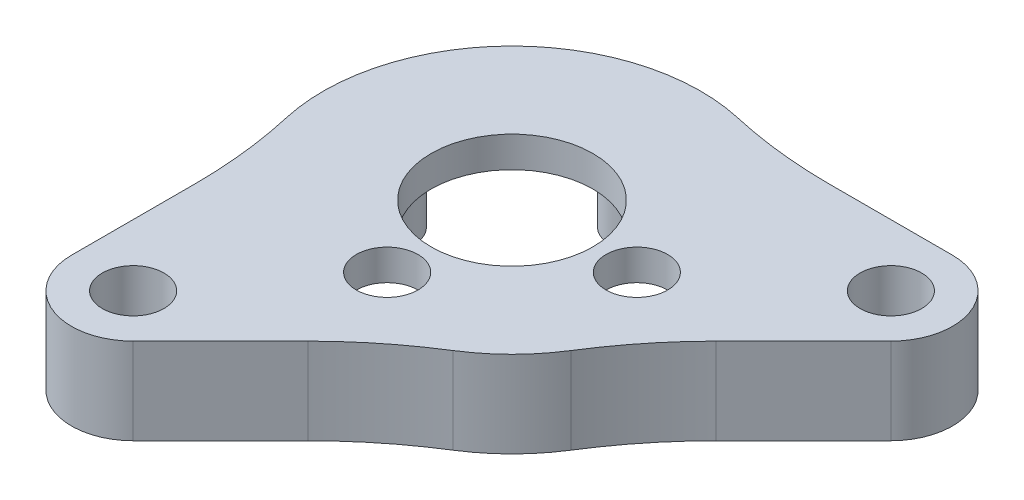
ISO-10303-21;
HEADER;
FILE_DESCRIPTION(('STEP AP214'),'2;1');
FILE_NAME('part.step','',(''),(''),'','','');
FILE_SCHEMA(('AUTOMOTIVE_DESIGN { 1 0 10303 214 1 1 1 1 }'));
ENDSEC;
DATA;
#1=APPLICATION_CONTEXT('core data for automotive mechanical design processes');
#2=APPLICATION_PROTOCOL_DEFINITION('international standard','automotive_design',2000,#1);
#3=PRODUCT_CONTEXT('',#1,'mechanical');
#4=PRODUCT('Part','Part','',(#3));
#5=PRODUCT_RELATED_PRODUCT_CATEGORY('part','',(#4));
#6=PRODUCT_DEFINITION_FORMATION('','',#4);
#7=PRODUCT_DEFINITION_CONTEXT('part definition',#1,'design');
#8=PRODUCT_DEFINITION('design','',#6,#7);
#9=PRODUCT_DEFINITION_SHAPE('','',#8);
#10=(LENGTH_UNIT() NAMED_UNIT(*) SI_UNIT(.MILLI.,.METRE.));
#11=(NAMED_UNIT(*) PLANE_ANGLE_UNIT() SI_UNIT($,.RADIAN.));
#12=(NAMED_UNIT(*) SI_UNIT($,.STERADIAN.) SOLID_ANGLE_UNIT());
#13=UNCERTAINTY_MEASURE_WITH_UNIT(LENGTH_MEASURE(1.E-05),#10,'distance_accuracy_value','');
#14=(GEOMETRIC_REPRESENTATION_CONTEXT(3) GLOBAL_UNCERTAINTY_ASSIGNED_CONTEXT((#13)) GLOBAL_UNIT_ASSIGNED_CONTEXT((#10,
#11,#12)) REPRESENTATION_CONTEXT('',''));
#15=CARTESIAN_POINT('',(0.,0.,0.));
#16=DIRECTION('',(0.,0.,1.));
#17=DIRECTION('',(1.,0.,0.));
#18=AXIS2_PLACEMENT_3D('',#15,#16,#17);
#19=CARTESIAN_POINT('',(0.,3.6,0.));
#20=DIRECTION('',(0.,-1.,0.));
#21=DIRECTION('',(0.,0.,-1.));
#22=AXIS2_PLACEMENT_3D('',#19,#20,#21);
#23=CYLINDRICAL_SURFACE('',#22,12.25);
#24=CARTESIAN_POINT('',(0.,0.,0.));
#25=DIRECTION('',(0.,1.,0.));
#26=DIRECTION('',(0.,0.,1.));
#27=AXIS2_PLACEMENT_3D('',#24,#25,#26);
#28=CIRCLE('',#27,12.25);
#29=CARTESIAN_POINT('',(6.52766769484698,0.,10.3659082798205));
#30=VERTEX_POINT('',#29);
#31=CARTESIAN_POINT('',(10.3659082798205,0.,6.52766769484701));
#32=VERTEX_POINT('',#31);
#33=EDGE_CURVE('E177',#30,#32,#28,.T.);
#34=ORIENTED_EDGE('',*,*,#33,.T.);
#35=DIRECTION('',(0.,-1.,0.));
#36=VECTOR('',#35,1.);
#37=CARTESIAN_POINT('',(10.3659082798205,3.6,6.52766769484701));
#38=LINE('',#37,#36);
#39=CARTESIAN_POINT('',(10.3659082798205,5.6,6.52766769484701));
#40=VERTEX_POINT('',#39);
#41=EDGE_CURVE('E219',#32,#40,#38,.F.);
#42=ORIENTED_EDGE('',*,*,#41,.T.);
#43=CARTESIAN_POINT('',(0.,5.6,0.));
#44=DIRECTION('',(0.,1.,0.));
#45=DIRECTION('',(0.,0.,1.));
#46=AXIS2_PLACEMENT_3D('',#43,#44,#45);
#47=CIRCLE('',#46,12.25);
#48=CARTESIAN_POINT('',(6.52766769484698,5.6,10.3659082798205));
#49=VERTEX_POINT('',#48);
#50=EDGE_CURVE('E141',#49,#40,#47,.T.);
#51=ORIENTED_EDGE('',*,*,#50,.F.);
#52=DIRECTION('',(0.,-1.,0.));
#53=VECTOR('',#52,1.);
#54=CARTESIAN_POINT('',(6.52766769484698,3.6,10.3659082798205));
#55=LINE('',#54,#53);
#56=EDGE_CURVE('E216',#49,#30,#55,.T.);
#57=ORIENTED_EDGE('',*,*,#56,.T.);
#58=EDGE_LOOP('',(#34,#42,#51,#57));
#59=FACE_BOUND('',#58,.T.);
#60=ADVANCED_FACE('F36',(#59),#23,.T.);
#61=CARTESIAN_POINT('',(7.91959594928932,3.6,7.91959594928935));
#62=DIRECTION('',(0.707106781186546,0.,0.707106781186549));
#63=DIRECTION('',(0.707106781186549,0.,-0.707106781186546));
#64=AXIS2_PLACEMENT_3D('',#61,#62,#63);
#65=PLANE('',#64);
#66=DIRECTION('',(0.707106781186549,0.,-0.707106781186546));
#67=VECTOR('',#66,1.);
#68=CARTESIAN_POINT('',(7.91959594928932,5.6,7.91959594928935));
#69=LINE('',#68,#67);
#70=CARTESIAN_POINT('',(14.5386026723559,5.6,1.30058922622283));
#71=VERTEX_POINT('',#70);
#72=CARTESIAN_POINT('',(20.2107647738325,5.6,-4.37157287525381));
#73=VERTEX_POINT('',#72);
#74=EDGE_CURVE('E128',#71,#73,#69,.T.);
#75=ORIENTED_EDGE('',*,*,#74,.F.);
#76=DIRECTION('',(0.,-1.,0.));
#77=VECTOR('',#76,1.);
#78=CARTESIAN_POINT('',(14.5386026723559,3.6,1.30058922622283));
#79=LINE('',#78,#77);
#80=CARTESIAN_POINT('',(14.5386026723559,0.,1.30058922622283));
#81=VERTEX_POINT('',#80);
#82=EDGE_CURVE('E214',#71,#81,#79,.T.);
#83=ORIENTED_EDGE('',*,*,#82,.T.);
#84=DIRECTION('',(-0.707106781186549,0.,0.707106781186546));
#85=VECTOR('',#84,1.);
#86=CARTESIAN_POINT('',(7.91959594928932,0.,7.91959594928935));
#87=LINE('',#86,#85);
#88=CARTESIAN_POINT('',(20.2107647738325,0.,-4.37157287525381));
#89=VERTEX_POINT('',#88);
#90=EDGE_CURVE('E147',#89,#81,#87,.T.);
#91=ORIENTED_EDGE('',*,*,#90,.F.);
#92=DIRECTION('',(0.,-1.,0.));
#93=VECTOR('',#92,1.);
#94=CARTESIAN_POINT('',(20.2107647738325,3.6,-4.37157287525381));
#95=LINE('',#94,#93);
#96=EDGE_CURVE('E144',#73,#89,#95,.T.);
#97=ORIENTED_EDGE('',*,*,#96,.F.);
#98=EDGE_LOOP('',(#75,#83,#91,#97));
#99=FACE_BOUND('',#98,.T.);
#100=ADVANCED_FACE('F145',(#99),#65,.T.);
#101=CARTESIAN_POINT('',(17.3823376490863,3.6,-7.2));
#102=DIRECTION('',(0.,-1.,0.));
#103=DIRECTION('',(0.,0.,-1.));
#104=AXIS2_PLACEMENT_3D('',#101,#102,#103);
#105=CYLINDRICAL_SURFACE('',#104,4.);
#106=CARTESIAN_POINT('',(17.3823376490863,0.,-7.2));
#107=DIRECTION('',(0.,1.,0.));
#108=DIRECTION('',(0.,0.,1.));
#109=AXIS2_PLACEMENT_3D('',#106,#107,#108);
#110=CIRCLE('',#109,4.);
#111=CARTESIAN_POINT('',(17.3823376490863,0.,-11.2));
#112=VERTEX_POINT('',#111);
#113=EDGE_CURVE('E181',#112,#89,#110,.F.);
#114=ORIENTED_EDGE('',*,*,#113,.F.);
#115=DIRECTION('',(0.,-1.,0.));
#116=VECTOR('',#115,1.);
#117=CARTESIAN_POINT('',(17.3823376490863,3.6,-11.2));
#118=LINE('',#117,#116);
#119=CARTESIAN_POINT('',(17.3823376490863,5.6,-11.2));
#120=VERTEX_POINT('',#119);
#121=EDGE_CURVE('E152',#120,#112,#118,.T.);
#122=ORIENTED_EDGE('',*,*,#121,.F.);
#123=CARTESIAN_POINT('',(17.3823376490863,5.6,-7.2));
#124=DIRECTION('',(0.,1.,0.));
#125=DIRECTION('',(0.,0.,1.));
#126=AXIS2_PLACEMENT_3D('',#123,#124,#125);
#127=CIRCLE('',#126,4.);
#128=EDGE_CURVE('E133',#73,#120,#127,.T.);
#129=ORIENTED_EDGE('',*,*,#128,.F.);
#130=ORIENTED_EDGE('',*,*,#96,.T.);
#131=EDGE_LOOP('',(#114,#122,#129,#130));
#132=FACE_BOUND('',#131,.T.);
#133=ADVANCED_FACE('F154',(#132),#105,.T.);
#134=CARTESIAN_POINT('',(0.,3.6,-11.2));
#135=DIRECTION('',(0.,0.,-1.));
#136=DIRECTION('',(-1.,0.,0.));
#137=AXIS2_PLACEMENT_3D('',#134,#135,#136);
#138=PLANE('',#137);
#139=DIRECTION('',(1.,0.,0.));
#140=VECTOR('',#139,1.);
#141=CARTESIAN_POINT('',(0.,0.,-11.2));
#142=LINE('',#141,#140);
#143=CARTESIAN_POINT('',(9.36068907719937,0.,-11.2));
#144=VERTEX_POINT('',#143);
#145=EDGE_CURVE('E183',#144,#112,#142,.T.);
#146=ORIENTED_EDGE('',*,*,#145,.F.);
#147=DIRECTION('',(0.,-1.,0.));
#148=VECTOR('',#147,1.);
#149=CARTESIAN_POINT('',(9.36068907719937,3.6,-11.2));
#150=LINE('',#149,#148);
#151=CARTESIAN_POINT('',(9.36068907719937,5.6,-11.2));
#152=VERTEX_POINT('',#151);
#153=EDGE_CURVE('E209',#144,#152,#150,.F.);
#154=ORIENTED_EDGE('',*,*,#153,.T.);
#155=DIRECTION('',(-1.,0.,0.));
#156=VECTOR('',#155,1.);
#157=CARTESIAN_POINT('',(0.,5.6,-11.2));
#158=LINE('',#157,#156);
#159=EDGE_CURVE('E156',#120,#152,#158,.T.);
#160=ORIENTED_EDGE('',*,*,#159,.F.);
#161=ORIENTED_EDGE('',*,*,#121,.T.);
#162=EDGE_LOOP('',(#146,#154,#160,#161));
#163=FACE_BOUND('',#162,.T.);
#164=ADVANCED_FACE('F284',(#163),#138,.T.);
#165=CARTESIAN_POINT('',(0.,3.6,0.));
#166=DIRECTION('',(0.,-1.,0.));
#167=DIRECTION('',(0.,0.,-1.));
#168=AXIS2_PLACEMENT_3D('',#165,#166,#167);
#169=CYLINDRICAL_SURFACE('',#168,12.25);
#170=CARTESIAN_POINT('',(0.,5.6,0.));
#171=DIRECTION('',(0.,1.,0.));
#172=DIRECTION('',(0.,0.,1.));
#173=AXIS2_PLACEMENT_3D('',#170,#171,#172);
#174=CIRCLE('',#173,12.25);
#175=CARTESIAN_POINT('',(2.71404594546017,5.6,-11.9455621301775));
#176=VERTEX_POINT('',#175);
#177=CARTESIAN_POINT('',(-11.9455621301775,5.6,2.71404594546014));
#178=VERTEX_POINT('',#177);
#179=EDGE_CURVE('E158',#176,#178,#174,.T.);
#180=ORIENTED_EDGE('',*,*,#179,.F.);
#181=DIRECTION('',(0.,-1.,0.));
#182=VECTOR('',#181,1.);
#183=CARTESIAN_POINT('',(2.71404594546017,3.6,-11.9455621301775));
#184=LINE('',#183,#182);
#185=CARTESIAN_POINT('',(2.71404594546017,0.,-11.9455621301775));
#186=VERTEX_POINT('',#185);
#187=EDGE_CURVE('E206',#176,#186,#184,.T.);
#188=ORIENTED_EDGE('',*,*,#187,.T.);
#189=CARTESIAN_POINT('',(0.,0.,0.));
#190=DIRECTION('',(0.,1.,0.));
#191=DIRECTION('',(0.,0.,1.));
#192=AXIS2_PLACEMENT_3D('',#189,#190,#191);
#193=CIRCLE('',#192,12.25);
#194=CARTESIAN_POINT('',(-11.9455621301775,0.,2.71404594546014));
#195=VERTEX_POINT('',#194);
#196=EDGE_CURVE('E185',#186,#195,#193,.T.);
#197=ORIENTED_EDGE('',*,*,#196,.T.);
#198=DIRECTION('',(0.,-1.,0.));
#199=VECTOR('',#198,1.);
#200=CARTESIAN_POINT('',(-11.9455621301775,3.6,2.71404594546014));
#201=LINE('',#200,#199);
#202=EDGE_CURVE('E151',#195,#178,#201,.F.);
#203=ORIENTED_EDGE('',*,*,#202,.T.);
#204=EDGE_LOOP('',(#180,#188,#197,#203));
#205=FACE_BOUND('',#204,.T.);
#206=ADVANCED_FACE('F291',(#205),#169,.T.);
#207=CARTESIAN_POINT('',(-11.2,3.6,0.));
#208=DIRECTION('',(1.,0.,0.));
#209=DIRECTION('',(0.,0.,-1.));
#210=AXIS2_PLACEMENT_3D('',#207,#208,#209);
#211=PLANE('',#210);
#212=DIRECTION('',(0.,0.,1.));
#213=VECTOR('',#212,1.);
#214=CARTESIAN_POINT('',(-11.2,5.6,0.));
#215=LINE('',#214,#213);
#216=CARTESIAN_POINT('',(-11.2,5.6,9.36068907719937));
#217=VERTEX_POINT('',#216);
#218=CARTESIAN_POINT('',(-11.2000000000001,5.6,17.3823376490863));
#219=VERTEX_POINT('',#218);
#220=EDGE_CURVE('E164',#217,#219,#215,.T.);
#221=ORIENTED_EDGE('',*,*,#220,.F.);
#222=DIRECTION('',(0.,1.,0.));
#223=VECTOR('',#222,1.);
#224=CARTESIAN_POINT('',(-11.2,0.,9.36068907719937));
#225=LINE('',#224,#223);
#226=CARTESIAN_POINT('',(-11.2,0.,9.36068907719937));
#227=VERTEX_POINT('',#226);
#228=EDGE_CURVE('E211',#217,#227,#225,.F.);
#229=ORIENTED_EDGE('',*,*,#228,.T.);
#230=DIRECTION('',(0.,0.,1.));
#231=VECTOR('',#230,1.);
#232=CARTESIAN_POINT('',(-11.2,0.,0.));
#233=LINE('',#232,#231);
#234=CARTESIAN_POINT('',(-11.2000000000001,0.,17.3823376490863));
#235=VERTEX_POINT('',#234);
#236=EDGE_CURVE('E188',#227,#235,#233,.T.);
#237=ORIENTED_EDGE('',*,*,#236,.T.);
#238=DIRECTION('',(0.,-1.,0.));
#239=VECTOR('',#238,1.);
#240=CARTESIAN_POINT('',(-11.2000000000001,3.6,17.3823376490863));
#241=LINE('',#240,#239);
#242=EDGE_CURVE('E201',#219,#235,#241,.T.);
#243=ORIENTED_EDGE('',*,*,#242,.F.);
#244=EDGE_LOOP('',(#221,#229,#237,#243));
#245=FACE_BOUND('',#244,.T.);
#246=ADVANCED_FACE('F301',(#245),#211,.F.);
#247=CARTESIAN_POINT('',(-7.20000000000006,3.6,17.3823376490863));
#248=DIRECTION('',(0.,-1.,0.));
#249=DIRECTION('',(0.,0.,-1.));
#250=AXIS2_PLACEMENT_3D('',#247,#248,#249);
#251=CYLINDRICAL_SURFACE('',#250,4.);
#252=CARTESIAN_POINT('',(-7.20000000000006,0.,17.3823376490863));
#253=DIRECTION('',(0.,1.,0.));
#254=DIRECTION('',(0.,0.,1.));
#255=AXIS2_PLACEMENT_3D('',#252,#253,#254);
#256=CIRCLE('',#255,4.);
#257=CARTESIAN_POINT('',(-4.37157287525386,0.,20.2107647738325));
#258=VERTEX_POINT('',#257);
#259=EDGE_CURVE('E190',#235,#258,#256,.T.);
#260=ORIENTED_EDGE('',*,*,#259,.T.);
#261=DIRECTION('',(0.,-1.,0.));
#262=VECTOR('',#261,1.);
#263=CARTESIAN_POINT('',(-4.37157287525386,3.6,20.2107647738325));
#264=LINE('',#263,#262);
#265=CARTESIAN_POINT('',(-4.37157287525386,5.6,20.2107647738325));
#266=VERTEX_POINT('',#265);
#267=EDGE_CURVE('E198',#266,#258,#264,.T.);
#268=ORIENTED_EDGE('',*,*,#267,.F.);
#269=CARTESIAN_POINT('',(-7.20000000000006,5.6,17.3823376490863));
#270=DIRECTION('',(0.,1.,0.));
#271=DIRECTION('',(0.,0.,1.));
#272=AXIS2_PLACEMENT_3D('',#269,#270,#271);
#273=CIRCLE('',#272,4.);
#274=EDGE_CURVE('E166',#219,#266,#273,.T.);
#275=ORIENTED_EDGE('',*,*,#274,.F.);
#276=ORIENTED_EDGE('',*,*,#242,.T.);
#277=EDGE_LOOP('',(#260,#268,#275,#276));
#278=FACE_BOUND('',#277,.T.);
#279=ADVANCED_FACE('F306',(#278),#251,.T.);
#280=CARTESIAN_POINT('',(7.91959594928932,3.6,7.91959594928935));
#281=DIRECTION('',(0.707106781186546,0.,0.707106781186549));
#282=DIRECTION('',(0.707106781186549,0.,-0.707106781186546));
#283=AXIS2_PLACEMENT_3D('',#280,#281,#282);
#284=PLANE('',#283);
#285=DIRECTION('',(-0.707106781186549,0.,0.707106781186546));
#286=VECTOR('',#285,1.);
#287=CARTESIAN_POINT('',(7.91959594928932,0.,7.91959594928935));
#288=LINE('',#287,#286);
#289=CARTESIAN_POINT('',(1.30058922622279,0.,14.5386026723559));
#290=VERTEX_POINT('',#289);
#291=EDGE_CURVE('E193',#290,#258,#288,.T.);
#292=ORIENTED_EDGE('',*,*,#291,.F.);
#293=DIRECTION('',(0.,-1.,0.));
#294=VECTOR('',#293,1.);
#295=CARTESIAN_POINT('',(1.30058922622279,3.6,14.5386026723559));
#296=LINE('',#295,#294);
#297=CARTESIAN_POINT('',(1.30058922622279,5.6,14.5386026723559));
#298=VERTEX_POINT('',#297);
#299=EDGE_CURVE('E53',#290,#298,#296,.F.);
#300=ORIENTED_EDGE('',*,*,#299,.T.);
#301=DIRECTION('',(0.707106781186549,0.,-0.707106781186546));
#302=VECTOR('',#301,1.);
#303=CARTESIAN_POINT('',(7.91959594928932,5.6,7.91959594928935));
#304=LINE('',#303,#302);
#305=EDGE_CURVE('E270',#266,#298,#304,.T.);
#306=ORIENTED_EDGE('',*,*,#305,.F.);
#307=ORIENTED_EDGE('',*,*,#267,.T.);
#308=EDGE_LOOP('',(#292,#300,#306,#307));
#309=FACE_BOUND('',#308,.T.);
#310=ADVANCED_FACE('F305',(#309),#284,.T.);
#311=CARTESIAN_POINT('',(0.,3.6,0.));
#312=DIRECTION('',(0.,-1.,0.));
#313=DIRECTION('',(0.,0.,-1.));
#314=AXIS2_PLACEMENT_3D('',#311,#312,#313);
#315=CYLINDRICAL_SURFACE('',#314,11.2);
#316=CARTESIAN_POINT('',(0.,3.6,0.));
#317=DIRECTION('',(0.,1.,0.));
#318=DIRECTION('',(0.,0.,1.));
#319=AXIS2_PLACEMENT_3D('',#316,#317,#318);
#320=CIRCLE('',#319,11.2);
#321=CARTESIAN_POINT('',(0.,3.6,11.2));
#322=VERTEX_POINT('',#321);
#323=EDGE_CURVE('E169',#322,#322,#320,.T.);
#324=ORIENTED_EDGE('',*,*,#323,.T.);
#325=EDGE_LOOP('',(#324));
#326=FACE_BOUND('',#325,.T.);
#327=CARTESIAN_POINT('',(0.,0.,0.));
#328=DIRECTION('',(0.,1.,0.));
#329=DIRECTION('',(0.,0.,1.));
#330=AXIS2_PLACEMENT_3D('',#327,#328,#329);
#331=CIRCLE('',#330,11.2);
#332=CARTESIAN_POINT('',(0.,0.,11.2));
#333=VERTEX_POINT('',#332);
#334=EDGE_CURVE('E195',#333,#333,#331,.T.);
#335=ORIENTED_EDGE('',*,*,#334,.F.);
#336=EDGE_LOOP('',(#335));
#337=FACE_BOUND('',#336,.T.);
#338=ADVANCED_FACE('F313',(#326,#337),#315,.F.);
#339=CARTESIAN_POINT('',(0.,0.,0.));
#340=DIRECTION('',(0.,1.,0.));
#341=DIRECTION('',(0.,0.,1.));
#342=AXIS2_PLACEMENT_3D('',#339,#340,#341);
#343=PLANE('',#342);
#344=CARTESIAN_POINT('',(-7.20000000000006,0.,17.3823376490863));
#345=DIRECTION('',(0.,1.,0.));
#346=DIRECTION('',(0.,0.,1.));
#347=AXIS2_PLACEMENT_3D('',#344,#345,#346);
#348=CIRCLE('',#347,2.);
#349=CARTESIAN_POINT('',(-7.20000000000006,0.,19.3823376490863));
#350=VERTEX_POINT('',#349);
#351=EDGE_CURVE('E260',#350,#350,#348,.T.);
#352=ORIENTED_EDGE('',*,*,#351,.T.);
#353=EDGE_LOOP('',(#352));
#354=FACE_BOUND('',#353,.T.);
#355=CARTESIAN_POINT('',(17.3823376490863,0.,-7.2));
#356=DIRECTION('',(0.,1.,0.));
#357=DIRECTION('',(0.,0.,1.));
#358=AXIS2_PLACEMENT_3D('',#355,#356,#357);
#359=CIRCLE('',#358,2.);
#360=CARTESIAN_POINT('',(17.3823376490863,0.,-5.2));
#361=VERTEX_POINT('',#360);
#362=EDGE_CURVE('E257',#361,#361,#359,.T.);
#363=ORIENTED_EDGE('',*,*,#362,.T.);
#364=EDGE_LOOP('',(#363));
#365=FACE_BOUND('',#364,.T.);
#366=ORIENTED_EDGE('',*,*,#33,.F.);
#367=CARTESIAN_POINT('',(22.5137926618192,0.,35.7518061079523));
#368=DIRECTION('',(0.,1.,0.));
#369=DIRECTION('',(0.,0.,1.));
#370=AXIS2_PLACEMENT_3D('',#367,#368,#369);
#371=CIRCLE('',#370,30.);
#372=EDGE_CURVE('E61',#30,#290,#371,.T.);
#373=ORIENTED_EDGE('',*,*,#372,.T.);
#374=ORIENTED_EDGE('',*,*,#291,.T.);
#375=ORIENTED_EDGE('',*,*,#259,.F.);
#376=ORIENTED_EDGE('',*,*,#236,.F.);
#377=CARTESIAN_POINT('',(-41.2,0.,9.36068907719927));
#378=DIRECTION('',(0.,1.,0.));
#379=DIRECTION('',(0.,0.,1.));
#380=AXIS2_PLACEMENT_3D('',#377,#378,#379);
#381=CIRCLE('',#380,30.);
#382=EDGE_CURVE('E226',#227,#195,#381,.T.);
#383=ORIENTED_EDGE('',*,*,#382,.T.);
#384=ORIENTED_EDGE('',*,*,#196,.F.);
#385=CARTESIAN_POINT('',(9.36068907719937,0.,-41.2));
#386=DIRECTION('',(0.,1.,0.));
#387=DIRECTION('',(0.,0.,1.));
#388=AXIS2_PLACEMENT_3D('',#385,#386,#387);
#389=CIRCLE('',#388,30.);
#390=EDGE_CURVE('E222',#186,#144,#389,.T.);
#391=ORIENTED_EDGE('',*,*,#390,.T.);
#392=ORIENTED_EDGE('',*,*,#145,.T.);
#393=ORIENTED_EDGE('',*,*,#113,.T.);
#394=ORIENTED_EDGE('',*,*,#90,.T.);
#395=CARTESIAN_POINT('',(35.7518061079522,0.,22.5137926618193));
#396=DIRECTION('',(0.,1.,0.));
#397=DIRECTION('',(0.,0.,1.));
#398=AXIS2_PLACEMENT_3D('',#395,#396,#397);
#399=CIRCLE('',#398,30.);
#400=EDGE_CURVE('E230',#81,#32,#399,.T.);
#401=ORIENTED_EDGE('',*,*,#400,.T.);
#402=EDGE_LOOP('',(#366,#373,#374,#375,#376,#383,#384,#391,#392,#393,#394,#401));
#403=FACE_BOUND('',#402,.T.);
#404=ORIENTED_EDGE('',*,*,#334,.T.);
#405=EDGE_LOOP('',(#404));
#406=FACE_BOUND('',#405,.T.);
#407=ADVANCED_FACE('F278',(#354,#365,#403,#406),#343,.F.);
#408=CARTESIAN_POINT('',(0.,3.6,0.));
#409=DIRECTION('',(0.,1.,0.));
#410=DIRECTION('',(0.,0.,1.));
#411=AXIS2_PLACEMENT_3D('',#408,#409,#410);
#412=PLANE('',#411);
#413=CARTESIAN_POINT('',(8.09999999999999,3.6,0.));
#414=DIRECTION('',(0.,1.,0.));
#415=DIRECTION('',(0.,0.,1.));
#416=AXIS2_PLACEMENT_3D('',#413,#414,#415);
#417=CIRCLE('',#416,2.);
#418=CARTESIAN_POINT('',(8.09999999999999,3.6,1.99999999999994));
#419=VERTEX_POINT('',#418);
#420=EDGE_CURVE('E240',#419,#419,#417,.F.);
#421=ORIENTED_EDGE('',*,*,#420,.F.);
#422=EDGE_LOOP('',(#421));
#423=FACE_BOUND('',#422,.T.);
#424=CARTESIAN_POINT('',(0.,3.6,8.09999999999999));
#425=DIRECTION('',(0.,1.,0.));
#426=DIRECTION('',(0.,0.,1.));
#427=AXIS2_PLACEMENT_3D('',#424,#425,#426);
#428=CIRCLE('',#427,2.);
#429=CARTESIAN_POINT('',(0.,3.6,10.1));
#430=VERTEX_POINT('',#429);
#431=EDGE_CURVE('E239',#430,#430,#428,.T.);
#432=ORIENTED_EDGE('',*,*,#431,.T.);
#433=EDGE_LOOP('',(#432));
#434=FACE_BOUND('',#433,.T.);
#435=CARTESIAN_POINT('',(0.,3.6,-8.1));
#436=DIRECTION('',(0.,1.,0.));
#437=DIRECTION('',(0.,0.,1.));
#438=AXIS2_PLACEMENT_3D('',#435,#436,#437);
#439=CIRCLE('',#438,1.8);
#440=CARTESIAN_POINT('',(0.,3.6,-6.3));
#441=VERTEX_POINT('',#440);
#442=EDGE_CURVE('E11',#441,#441,#439,.F.);
#443=ORIENTED_EDGE('',*,*,#442,.F.);
#444=EDGE_LOOP('',(#443));
#445=FACE_BOUND('',#444,.T.);
#446=CARTESIAN_POINT('',(-8.1,3.6,0.));
#447=DIRECTION('',(0.,1.,0.));
#448=DIRECTION('',(0.,0.,1.));
#449=AXIS2_PLACEMENT_3D('',#446,#447,#448);
#450=CIRCLE('',#449,1.8);
#451=CARTESIAN_POINT('',(-8.1,3.6,1.8));
#452=VERTEX_POINT('',#451);
#453=EDGE_CURVE('E45',#452,#452,#450,.F.);
#454=ORIENTED_EDGE('',*,*,#453,.F.);
#455=EDGE_LOOP('',(#454));
#456=FACE_BOUND('',#455,.T.);
#457=CARTESIAN_POINT('',(0.,3.6,0.));
#458=DIRECTION('',(0.,1.,0.));
#459=DIRECTION('',(0.,0.,1.));
#460=AXIS2_PLACEMENT_3D('',#457,#458,#459);
#461=CIRCLE('',#460,5.25);
#462=CARTESIAN_POINT('',(0.,3.6,5.25));
#463=VERTEX_POINT('',#462);
#464=EDGE_CURVE('E170',#463,#463,#461,.T.);
#465=ORIENTED_EDGE('',*,*,#464,.T.);
#466=EDGE_LOOP('',(#465));
#467=FACE_BOUND('',#466,.T.);
#468=ORIENTED_EDGE('',*,*,#323,.F.);
#469=EDGE_LOOP('',(#468));
#470=FACE_BOUND('',#469,.T.);
#471=ADVANCED_FACE('F360',(#423,#434,#445,#456,#467,#470),#412,.F.);
#472=CARTESIAN_POINT('',(0.,5.6,0.));
#473=DIRECTION('',(0.,-1.,0.));
#474=DIRECTION('',(0.,0.,-1.));
#475=AXIS2_PLACEMENT_3D('',#472,#473,#474);
#476=CYLINDRICAL_SURFACE('',#475,5.25);
#477=CARTESIAN_POINT('',(0.,5.6,0.));
#478=DIRECTION('',(0.,1.,0.));
#479=DIRECTION('',(0.,0.,1.));
#480=AXIS2_PLACEMENT_3D('',#477,#478,#479);
#481=CIRCLE('',#480,5.25);
#482=CARTESIAN_POINT('',(0.,5.6,5.25));
#483=VERTEX_POINT('',#482);
#484=EDGE_CURVE('E173',#483,#483,#481,.T.);
#485=ORIENTED_EDGE('',*,*,#484,.T.);
#486=EDGE_LOOP('',(#485));
#487=FACE_BOUND('',#486,.T.);
#488=ORIENTED_EDGE('',*,*,#464,.F.);
#489=EDGE_LOOP('',(#488));
#490=FACE_BOUND('',#489,.T.);
#491=ADVANCED_FACE('F358',(#487,#490),#476,.F.);
#492=CARTESIAN_POINT('',(0.,5.6,0.));
#493=DIRECTION('',(0.,1.,0.));
#494=DIRECTION('',(0.,0.,1.));
#495=AXIS2_PLACEMENT_3D('',#492,#493,#494);
#496=PLANE('',#495);
#497=CARTESIAN_POINT('',(8.09999999999999,5.6,0.));
#498=DIRECTION('',(0.,1.,0.));
#499=DIRECTION('',(0.,0.,1.));
#500=AXIS2_PLACEMENT_3D('',#497,#498,#499);
#501=CIRCLE('',#500,2.);
#502=CARTESIAN_POINT('',(8.09999999999999,5.6,1.99999999999994));
#503=VERTEX_POINT('',#502);
#504=EDGE_CURVE('E40',#503,#503,#501,.F.);
#505=ORIENTED_EDGE('',*,*,#504,.T.);
#506=EDGE_LOOP('',(#505));
#507=FACE_BOUND('',#506,.T.);
#508=CARTESIAN_POINT('',(0.,5.6,8.09999999999999));
#509=DIRECTION('',(0.,1.,0.));
#510=DIRECTION('',(0.,0.,1.));
#511=AXIS2_PLACEMENT_3D('',#508,#509,#510);
#512=CIRCLE('',#511,2.);
#513=CARTESIAN_POINT('',(0.,5.6,10.1));
#514=VERTEX_POINT('',#513);
#515=EDGE_CURVE('E237',#514,#514,#512,.T.);
#516=ORIENTED_EDGE('',*,*,#515,.F.);
#517=EDGE_LOOP('',(#516));
#518=FACE_BOUND('',#517,.T.);
#519=CARTESIAN_POINT('',(-7.20000000000006,5.6,17.3823376490863));
#520=DIRECTION('',(0.,1.,0.));
#521=DIRECTION('',(0.,0.,1.));
#522=AXIS2_PLACEMENT_3D('',#519,#520,#521);
#523=CIRCLE('',#522,2.);
#524=CARTESIAN_POINT('',(-7.20000000000006,5.6,19.3823376490863));
#525=VERTEX_POINT('',#524);
#526=EDGE_CURVE('E174',#525,#525,#523,.T.);
#527=ORIENTED_EDGE('',*,*,#526,.F.);
#528=EDGE_LOOP('',(#527));
#529=FACE_BOUND('',#528,.T.);
#530=CARTESIAN_POINT('',(17.3823376490863,5.6,-7.2));
#531=DIRECTION('',(0.,1.,0.));
#532=DIRECTION('',(0.,0.,1.));
#533=AXIS2_PLACEMENT_3D('',#530,#531,#532);
#534=CIRCLE('',#533,2.);
#535=CARTESIAN_POINT('',(17.3823376490863,5.6,-5.2));
#536=VERTEX_POINT('',#535);
#537=EDGE_CURVE('E263',#536,#536,#534,.T.);
#538=ORIENTED_EDGE('',*,*,#537,.F.);
#539=EDGE_LOOP('',(#538));
#540=FACE_BOUND('',#539,.T.);
#541=ORIENTED_EDGE('',*,*,#484,.F.);
#542=EDGE_LOOP('',(#541));
#543=FACE_BOUND('',#542,.T.);
#544=ORIENTED_EDGE('',*,*,#305,.T.);
#545=CARTESIAN_POINT('',(22.5137926618192,5.6,35.7518061079523));
#546=DIRECTION('',(0.,1.,0.));
#547=DIRECTION('',(0.,0.,1.));
#548=AXIS2_PLACEMENT_3D('',#545,#546,#547);
#549=CIRCLE('',#548,30.);
#550=EDGE_CURVE('E234',#298,#49,#549,.F.);
#551=ORIENTED_EDGE('',*,*,#550,.T.);
#552=ORIENTED_EDGE('',*,*,#50,.T.);
#553=CARTESIAN_POINT('',(35.7518061079522,5.6,22.5137926618193));
#554=DIRECTION('',(0.,1.,0.));
#555=DIRECTION('',(0.,0.,1.));
#556=AXIS2_PLACEMENT_3D('',#553,#554,#555);
#557=CIRCLE('',#556,30.);
#558=EDGE_CURVE('E137',#40,#71,#557,.F.);
#559=ORIENTED_EDGE('',*,*,#558,.T.);
#560=ORIENTED_EDGE('',*,*,#74,.T.);
#561=ORIENTED_EDGE('',*,*,#128,.T.);
#562=ORIENTED_EDGE('',*,*,#159,.T.);
#563=CARTESIAN_POINT('',(9.36068907719937,5.6,-41.2));
#564=DIRECTION('',(0.,1.,0.));
#565=DIRECTION('',(0.,0.,1.));
#566=AXIS2_PLACEMENT_3D('',#563,#564,#565);
#567=CIRCLE('',#566,30.);
#568=EDGE_CURVE('E224',#152,#176,#567,.F.);
#569=ORIENTED_EDGE('',*,*,#568,.T.);
#570=ORIENTED_EDGE('',*,*,#179,.T.);
#571=CARTESIAN_POINT('',(-41.2,5.6,9.36068907719927));
#572=DIRECTION('',(0.,1.,0.));
#573=DIRECTION('',(0.,0.,1.));
#574=AXIS2_PLACEMENT_3D('',#571,#572,#573);
#575=CIRCLE('',#574,30.);
#576=EDGE_CURVE('E228',#178,#217,#575,.F.);
#577=ORIENTED_EDGE('',*,*,#576,.T.);
#578=ORIENTED_EDGE('',*,*,#220,.T.);
#579=ORIENTED_EDGE('',*,*,#274,.T.);
#580=EDGE_LOOP('',(#544,#551,#552,#559,#560,#561,#562,#569,#570,#577,#578,#579));
#581=FACE_BOUND('',#580,.T.);
#582=ADVANCED_FACE('F130',(#507,#518,#529,#540,#543,#581),#496,.T.);
#583=CARTESIAN_POINT('',(17.3823376490863,5.6,-7.2));
#584=DIRECTION('',(0.,-1.,0.));
#585=DIRECTION('',(0.,0.,-1.));
#586=AXIS2_PLACEMENT_3D('',#583,#584,#585);
#587=CYLINDRICAL_SURFACE('',#586,2.);
#588=ORIENTED_EDGE('',*,*,#537,.T.);
#589=EDGE_LOOP('',(#588));
#590=FACE_BOUND('',#589,.T.);
#591=ORIENTED_EDGE('',*,*,#362,.F.);
#592=EDGE_LOOP('',(#591));
#593=FACE_BOUND('',#592,.T.);
#594=ADVANCED_FACE('F351',(#590,#593),#587,.F.);
#595=CARTESIAN_POINT('',(-7.20000000000006,5.6,17.3823376490863));
#596=DIRECTION('',(0.,-1.,0.));
#597=DIRECTION('',(0.,0.,-1.));
#598=AXIS2_PLACEMENT_3D('',#595,#596,#597);
#599=CYLINDRICAL_SURFACE('',#598,2.);
#600=ORIENTED_EDGE('',*,*,#526,.T.);
#601=EDGE_LOOP('',(#600));
#602=FACE_BOUND('',#601,.T.);
#603=ORIENTED_EDGE('',*,*,#351,.F.);
#604=EDGE_LOOP('',(#603));
#605=FACE_BOUND('',#604,.T.);
#606=ADVANCED_FACE('F326',(#602,#605),#599,.F.);
#607=CARTESIAN_POINT('',(9.36068907719937,3.6,-41.2));
#608=DIRECTION('',(0.,-1.,0.));
#609=DIRECTION('',(0.,0.,-1.));
#610=AXIS2_PLACEMENT_3D('',#607,#608,#609);
#611=CYLINDRICAL_SURFACE('',#610,30.);
#612=ORIENTED_EDGE('',*,*,#568,.F.);
#613=ORIENTED_EDGE('',*,*,#153,.F.);
#614=ORIENTED_EDGE('',*,*,#390,.F.);
#615=ORIENTED_EDGE('',*,*,#187,.F.);
#616=EDGE_LOOP('',(#612,#613,#614,#615));
#617=FACE_BOUND('',#616,.T.);
#618=ADVANCED_FACE('F289',(#617),#611,.F.);
#619=CARTESIAN_POINT('',(-41.2,3.6,9.36068907719927));
#620=DIRECTION('',(0.,-1.,0.));
#621=DIRECTION('',(0.,0.,-1.));
#622=AXIS2_PLACEMENT_3D('',#619,#620,#621);
#623=CYLINDRICAL_SURFACE('',#622,30.);
#624=ORIENTED_EDGE('',*,*,#576,.F.);
#625=ORIENTED_EDGE('',*,*,#202,.F.);
#626=ORIENTED_EDGE('',*,*,#382,.F.);
#627=ORIENTED_EDGE('',*,*,#228,.F.);
#628=EDGE_LOOP('',(#624,#625,#626,#627));
#629=FACE_BOUND('',#628,.T.);
#630=ADVANCED_FACE('F298',(#629),#623,.F.);
#631=CARTESIAN_POINT('',(35.7518061079522,3.6,22.5137926618193));
#632=DIRECTION('',(0.,-1.,0.));
#633=DIRECTION('',(0.,0.,-1.));
#634=AXIS2_PLACEMENT_3D('',#631,#632,#633);
#635=CYLINDRICAL_SURFACE('',#634,30.);
#636=ORIENTED_EDGE('',*,*,#558,.F.);
#637=ORIENTED_EDGE('',*,*,#41,.F.);
#638=ORIENTED_EDGE('',*,*,#400,.F.);
#639=ORIENTED_EDGE('',*,*,#82,.F.);
#640=EDGE_LOOP('',(#636,#637,#638,#639));
#641=FACE_BOUND('',#640,.T.);
#642=ADVANCED_FACE('F277',(#641),#635,.F.);
#643=CARTESIAN_POINT('',(22.5137926618192,3.6,35.7518061079523));
#644=DIRECTION('',(0.,-1.,0.));
#645=DIRECTION('',(0.,0.,-1.));
#646=AXIS2_PLACEMENT_3D('',#643,#644,#645);
#647=CYLINDRICAL_SURFACE('',#646,30.);
#648=ORIENTED_EDGE('',*,*,#550,.F.);
#649=ORIENTED_EDGE('',*,*,#299,.F.);
#650=ORIENTED_EDGE('',*,*,#372,.F.);
#651=ORIENTED_EDGE('',*,*,#56,.F.);
#652=EDGE_LOOP('',(#648,#649,#650,#651));
#653=FACE_BOUND('',#652,.T.);
#654=ADVANCED_FACE('F38',(#653),#647,.F.);
#655=CARTESIAN_POINT('',(-8.1,-5.09116882454314,0.));
#656=DIRECTION('',(0.,1.,0.));
#657=DIRECTION('',(0.,0.,1.));
#658=AXIS2_PLACEMENT_3D('',#655,#656,#657);
#659=CYLINDRICAL_SURFACE('',#658,1.8);
#660=CARTESIAN_POINT('',(-8.1,0.,0.));
#661=DIRECTION('',(0.,1.,0.));
#662=DIRECTION('',(0.,0.,1.));
#663=AXIS2_PLACEMENT_3D('',#660,#661,#662);
#664=CIRCLE('',#663,1.8);
#665=CARTESIAN_POINT('',(-8.1,0.,1.8));
#666=VERTEX_POINT('',#665);
#667=EDGE_CURVE('E254',#666,#666,#664,.T.);
#668=ORIENTED_EDGE('',*,*,#667,.T.);
#669=EDGE_LOOP('',(#668));
#670=FACE_BOUND('',#669,.T.);
#671=ORIENTED_EDGE('',*,*,#453,.T.);
#672=EDGE_LOOP('',(#671));
#673=FACE_BOUND('',#672,.T.);
#674=ADVANCED_FACE('F332',(#670,#673),#659,.T.);
#675=CARTESIAN_POINT('',(0.,0.,0.));
#676=DIRECTION('',(0.,1.,0.));
#677=DIRECTION('',(0.,0.,1.));
#678=AXIS2_PLACEMENT_3D('',#675,#676,#677);
#679=PLANE('',#678);
#680=ORIENTED_EDGE('',*,*,#667,.F.);
#681=EDGE_LOOP('',(#680));
#682=FACE_BOUND('',#681,.T.);
#683=ADVANCED_FACE('F337',(#682),#679,.F.);
#684=CARTESIAN_POINT('',(0.,-5.09116882454314,-8.1));
#685=DIRECTION('',(0.,1.,0.));
#686=DIRECTION('',(0.,0.,1.));
#687=AXIS2_PLACEMENT_3D('',#684,#685,#686);
#688=CYLINDRICAL_SURFACE('',#687,1.8);
#689=CARTESIAN_POINT('',(0.,0.,-8.1));
#690=DIRECTION('',(0.,1.,0.));
#691=DIRECTION('',(0.,0.,1.));
#692=AXIS2_PLACEMENT_3D('',#689,#690,#691);
#693=CIRCLE('',#692,1.8);
#694=CARTESIAN_POINT('',(0.,0.,-6.3));
#695=VERTEX_POINT('',#694);
#696=EDGE_CURVE('E244',#695,#695,#693,.T.);
#697=ORIENTED_EDGE('',*,*,#696,.T.);
#698=EDGE_LOOP('',(#697));
#699=FACE_BOUND('',#698,.T.);
#700=ORIENTED_EDGE('',*,*,#442,.T.);
#701=EDGE_LOOP('',(#700));
#702=FACE_BOUND('',#701,.T.);
#703=ADVANCED_FACE('F343',(#699,#702),#688,.T.);
#704=CARTESIAN_POINT('',(0.,0.,0.));
#705=DIRECTION('',(0.,1.,0.));
#706=DIRECTION('',(0.,0.,1.));
#707=AXIS2_PLACEMENT_3D('',#704,#705,#706);
#708=PLANE('',#707);
#709=ORIENTED_EDGE('',*,*,#696,.F.);
#710=EDGE_LOOP('',(#709));
#711=FACE_BOUND('',#710,.T.);
#712=ADVANCED_FACE('F442',(#711),#708,.F.);
#713=CARTESIAN_POINT('',(0.,10.,8.09999999999999));
#714=DIRECTION('',(0.,-1.,0.));
#715=DIRECTION('',(0.,0.,-1.));
#716=AXIS2_PLACEMENT_3D('',#713,#714,#715);
#717=CYLINDRICAL_SURFACE('',#716,2.);
#718=ORIENTED_EDGE('',*,*,#515,.T.);
#719=EDGE_LOOP('',(#718));
#720=FACE_BOUND('',#719,.T.);
#721=ORIENTED_EDGE('',*,*,#431,.F.);
#722=EDGE_LOOP('',(#721));
#723=FACE_BOUND('',#722,.T.);
#724=ADVANCED_FACE('F450',(#720,#723),#717,.F.);
#725=CARTESIAN_POINT('',(8.09999999999999,10.,0.));
#726=DIRECTION('',(0.,-1.,0.));
#727=DIRECTION('',(0.,0.,-1.));
#728=AXIS2_PLACEMENT_3D('',#725,#726,#727);
#729=CYLINDRICAL_SURFACE('',#728,2.);
#730=ORIENTED_EDGE('',*,*,#504,.F.);
#731=EDGE_LOOP('',(#730));
#732=FACE_BOUND('',#731,.T.);
#733=ORIENTED_EDGE('',*,*,#420,.T.);
#734=EDGE_LOOP('',(#733));
#735=FACE_BOUND('',#734,.T.);
#736=ADVANCED_FACE('F459',(#732,#735),#729,.F.);
#737=CLOSED_SHELL('',(#60,#100,#133,#164,#206,#246,#279,#310,#338,#407,#471,#491,#582,#594,#606,
#618,#630,#642,#654,#674,#683,#703,#712,#724,#736));
#738=MANIFOLD_SOLID_BREP('B2',#737);
#739=ADVANCED_BREP_SHAPE_REPRESENTATION('',(#18,#738),#14);
#740=SHAPE_DEFINITION_REPRESENTATION(#9,#739);
ENDSEC;
END-ISO-10303-21;
